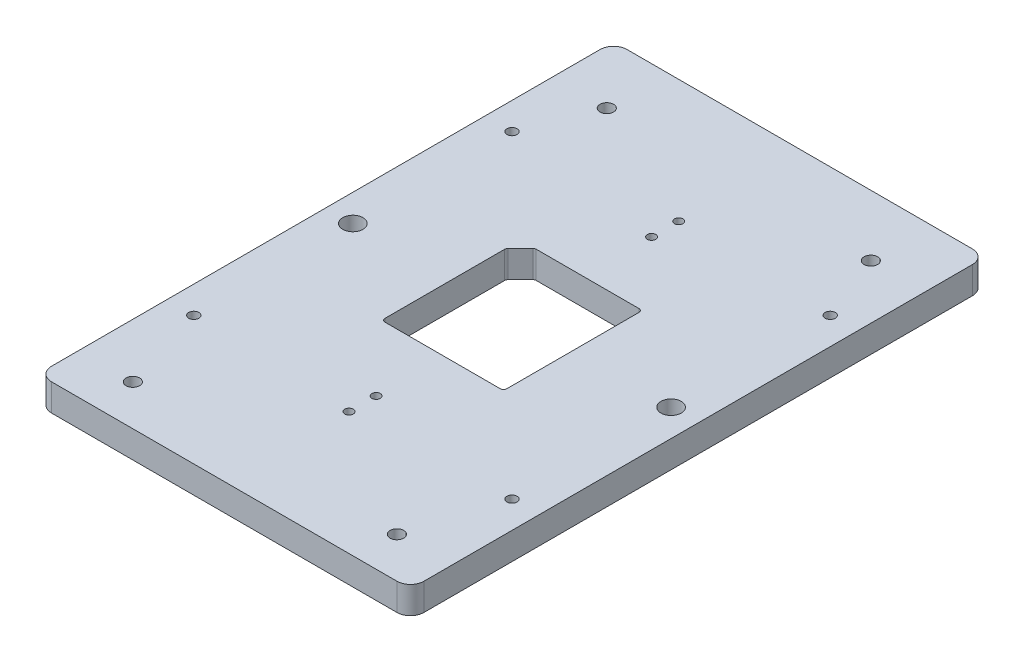
ISO-10303-21;
HEADER;
FILE_DESCRIPTION(('STEP AP214'),'2;1');
FILE_NAME('part.step','',(''),(''),'','','');
FILE_SCHEMA(('AUTOMOTIVE_DESIGN { 1 0 10303 214 1 1 1 1 }'));
ENDSEC;
DATA;
#1=APPLICATION_CONTEXT('core data for automotive mechanical design processes');
#2=APPLICATION_PROTOCOL_DEFINITION('international standard','automotive_design',2000,#1);
#3=PRODUCT_CONTEXT('',#1,'mechanical');
#4=PRODUCT('Part','Part','',(#3));
#5=PRODUCT_RELATED_PRODUCT_CATEGORY('part','',(#4));
#6=PRODUCT_DEFINITION_FORMATION('','',#4);
#7=PRODUCT_DEFINITION_CONTEXT('part definition',#1,'design');
#8=PRODUCT_DEFINITION('design','',#6,#7);
#9=PRODUCT_DEFINITION_SHAPE('','',#8);
#10=(LENGTH_UNIT() NAMED_UNIT(*) SI_UNIT(.MILLI.,.METRE.));
#11=(NAMED_UNIT(*) PLANE_ANGLE_UNIT() SI_UNIT($,.RADIAN.));
#12=(NAMED_UNIT(*) SI_UNIT($,.STERADIAN.) SOLID_ANGLE_UNIT());
#13=UNCERTAINTY_MEASURE_WITH_UNIT(LENGTH_MEASURE(1.E-05),#10,'distance_accuracy_value','');
#14=(GEOMETRIC_REPRESENTATION_CONTEXT(3) GLOBAL_UNCERTAINTY_ASSIGNED_CONTEXT((#13)) GLOBAL_UNIT_ASSIGNED_CONTEXT((#10,
#11,#12)) REPRESENTATION_CONTEXT('',''));
#15=CARTESIAN_POINT('',(0.,0.,0.));
#16=DIRECTION('',(0.,0.,1.));
#17=DIRECTION('',(1.,0.,0.));
#18=AXIS2_PLACEMENT_3D('',#15,#16,#17);
#19=CARTESIAN_POINT('',(-51.,8.,81.));
#20=DIRECTION('',(0.,-1.,0.));
#21=DIRECTION('',(0.,0.,-1.));
#22=AXIS2_PLACEMENT_3D('',#19,#20,#21);
#23=CYLINDRICAL_SURFACE('',#22,4.);
#24=CARTESIAN_POINT('',(-51.,0.,81.));
#25=DIRECTION('',(0.,1.,0.));
#26=DIRECTION('',(0.,0.,1.));
#27=AXIS2_PLACEMENT_3D('',#24,#25,#26);
#28=CIRCLE('',#27,4.);
#29=CARTESIAN_POINT('',(-55.,0.,81.));
#30=VERTEX_POINT('',#29);
#31=CARTESIAN_POINT('',(-51.,0.,85.));
#32=VERTEX_POINT('',#31);
#33=EDGE_CURVE('E138',#30,#32,#28,.T.);
#34=ORIENTED_EDGE('',*,*,#33,.T.);
#35=DIRECTION('',(0.,-1.,0.));
#36=VECTOR('',#35,1.);
#37=CARTESIAN_POINT('',(-51.,8.,85.));
#38=LINE('',#37,#36);
#39=CARTESIAN_POINT('',(-51.,8.,85.));
#40=VERTEX_POINT('',#39);
#41=EDGE_CURVE('E11',#40,#32,#38,.T.);
#42=ORIENTED_EDGE('',*,*,#41,.F.);
#43=CARTESIAN_POINT('',(-51.,8.,81.));
#44=DIRECTION('',(0.,1.,0.));
#45=DIRECTION('',(0.,0.,1.));
#46=AXIS2_PLACEMENT_3D('',#43,#44,#45);
#47=CIRCLE('',#46,4.);
#48=CARTESIAN_POINT('',(-55.,8.,81.));
#49=VERTEX_POINT('',#48);
#50=EDGE_CURVE('E152',#49,#40,#47,.T.);
#51=ORIENTED_EDGE('',*,*,#50,.F.);
#52=DIRECTION('',(0.,-1.,0.));
#53=VECTOR('',#52,1.);
#54=CARTESIAN_POINT('',(-55.,8.,81.));
#55=LINE('',#54,#53);
#56=EDGE_CURVE('E137',#49,#30,#55,.T.);
#57=ORIENTED_EDGE('',*,*,#56,.T.);
#58=EDGE_LOOP('',(#34,#42,#51,#57));
#59=FACE_BOUND('',#58,.T.);
#60=ADVANCED_FACE('F36',(#59),#23,.T.);
#61=CARTESIAN_POINT('',(-51.,8.,85.));
#62=DIRECTION('',(0.,0.,-1.));
#63=DIRECTION('',(-1.,0.,0.));
#64=AXIS2_PLACEMENT_3D('',#61,#62,#63);
#65=PLANE('',#64);
#66=DIRECTION('',(1.,0.,0.));
#67=VECTOR('',#66,1.);
#68=CARTESIAN_POINT('',(-51.,0.,85.));
#69=LINE('',#68,#67);
#70=CARTESIAN_POINT('',(51.,0.,85.));
#71=VERTEX_POINT('',#70);
#72=EDGE_CURVE('E141',#32,#71,#69,.T.);
#73=ORIENTED_EDGE('',*,*,#72,.T.);
#74=DIRECTION('',(0.,-1.,0.));
#75=VECTOR('',#74,1.);
#76=CARTESIAN_POINT('',(51.,8.,85.));
#77=LINE('',#76,#75);
#78=CARTESIAN_POINT('',(51.,8.,85.));
#79=VERTEX_POINT('',#78);
#80=EDGE_CURVE('E50',#79,#71,#77,.T.);
#81=ORIENTED_EDGE('',*,*,#80,.F.);
#82=DIRECTION('',(1.,0.,0.));
#83=VECTOR('',#82,1.);
#84=CARTESIAN_POINT('',(-51.,8.,85.));
#85=LINE('',#84,#83);
#86=EDGE_CURVE('E99',#40,#79,#85,.T.);
#87=ORIENTED_EDGE('',*,*,#86,.F.);
#88=ORIENTED_EDGE('',*,*,#41,.T.);
#89=EDGE_LOOP('',(#73,#81,#87,#88));
#90=FACE_BOUND('',#89,.T.);
#91=ADVANCED_FACE('F215',(#90),#65,.F.);
#92=CARTESIAN_POINT('',(51.,8.,81.));
#93=DIRECTION('',(0.,-1.,0.));
#94=DIRECTION('',(0.,0.,-1.));
#95=AXIS2_PLACEMENT_3D('',#92,#93,#94);
#96=CYLINDRICAL_SURFACE('',#95,4.);
#97=CARTESIAN_POINT('',(51.,0.,81.));
#98=DIRECTION('',(0.,1.,0.));
#99=DIRECTION('',(0.,0.,1.));
#100=AXIS2_PLACEMENT_3D('',#97,#98,#99);
#101=CIRCLE('',#100,4.);
#102=CARTESIAN_POINT('',(55.,0.,81.));
#103=VERTEX_POINT('',#102);
#104=EDGE_CURVE('E144',#71,#103,#101,.T.);
#105=ORIENTED_EDGE('',*,*,#104,.T.);
#106=DIRECTION('',(0.,-1.,0.));
#107=VECTOR('',#106,1.);
#108=CARTESIAN_POINT('',(55.,8.,81.));
#109=LINE('',#108,#107);
#110=CARTESIAN_POINT('',(55.,8.,81.));
#111=VERTEX_POINT('',#110);
#112=EDGE_CURVE('E161',#111,#103,#109,.T.);
#113=ORIENTED_EDGE('',*,*,#112,.F.);
#114=CARTESIAN_POINT('',(51.,8.,81.));
#115=DIRECTION('',(0.,1.,0.));
#116=DIRECTION('',(0.,0.,1.));
#117=AXIS2_PLACEMENT_3D('',#114,#115,#116);
#118=CIRCLE('',#117,4.);
#119=EDGE_CURVE('E226',#79,#111,#118,.T.);
#120=ORIENTED_EDGE('',*,*,#119,.F.);
#121=ORIENTED_EDGE('',*,*,#80,.T.);
#122=EDGE_LOOP('',(#105,#113,#120,#121));
#123=FACE_BOUND('',#122,.T.);
#124=ADVANCED_FACE('F220',(#123),#96,.T.);
#125=CARTESIAN_POINT('',(55.,8.,-80.9999999999999));
#126=DIRECTION('',(-1.,0.,0.));
#127=DIRECTION('',(0.,0.,1.));
#128=AXIS2_PLACEMENT_3D('',#125,#126,#127);
#129=PLANE('',#128);
#130=DIRECTION('',(0.,0.,-1.));
#131=VECTOR('',#130,1.);
#132=CARTESIAN_POINT('',(55.,0.,-80.9999999999999));
#133=LINE('',#132,#131);
#134=CARTESIAN_POINT('',(55.,0.,-80.9999999999999));
#135=VERTEX_POINT('',#134);
#136=EDGE_CURVE('E150',#103,#135,#133,.T.);
#137=ORIENTED_EDGE('',*,*,#136,.T.);
#138=DIRECTION('',(0.,-1.,0.));
#139=VECTOR('',#138,1.);
#140=CARTESIAN_POINT('',(55.,8.,-80.9999999999999));
#141=LINE('',#140,#139);
#142=CARTESIAN_POINT('',(55.,8.,-80.9999999999999));
#143=VERTEX_POINT('',#142);
#144=EDGE_CURVE('E158',#143,#135,#141,.T.);
#145=ORIENTED_EDGE('',*,*,#144,.F.);
#146=DIRECTION('',(0.,0.,-1.));
#147=VECTOR('',#146,1.);
#148=CARTESIAN_POINT('',(55.,8.,-80.9999999999999));
#149=LINE('',#148,#147);
#150=EDGE_CURVE('E227',#111,#143,#149,.T.);
#151=ORIENTED_EDGE('',*,*,#150,.F.);
#152=ORIENTED_EDGE('',*,*,#112,.T.);
#153=EDGE_LOOP('',(#137,#145,#151,#152));
#154=FACE_BOUND('',#153,.T.);
#155=ADVANCED_FACE('F502',(#154),#129,.F.);
#156=CARTESIAN_POINT('',(51.,8.,-81.));
#157=DIRECTION('',(0.,-1.,0.));
#158=DIRECTION('',(0.,0.,-1.));
#159=AXIS2_PLACEMENT_3D('',#156,#157,#158);
#160=CYLINDRICAL_SURFACE('',#159,4.);
#161=CARTESIAN_POINT('',(51.,0.,-81.));
#162=DIRECTION('',(0.,1.,0.));
#163=DIRECTION('',(0.,0.,-1.));
#164=AXIS2_PLACEMENT_3D('',#161,#162,#163);
#165=CIRCLE('',#164,4.);
#166=CARTESIAN_POINT('',(51.,0.,-85.));
#167=VERTEX_POINT('',#166);
#168=EDGE_CURVE('E149',#135,#167,#165,.T.);
#169=ORIENTED_EDGE('',*,*,#168,.T.);
#170=DIRECTION('',(0.,-1.,0.));
#171=VECTOR('',#170,1.);
#172=CARTESIAN_POINT('',(51.,8.,-85.));
#173=LINE('',#172,#171);
#174=CARTESIAN_POINT('',(51.,8.,-85.));
#175=VERTEX_POINT('',#174);
#176=EDGE_CURVE('E133',#175,#167,#173,.T.);
#177=ORIENTED_EDGE('',*,*,#176,.F.);
#178=CARTESIAN_POINT('',(51.,8.,-81.));
#179=DIRECTION('',(0.,1.,0.));
#180=DIRECTION('',(0.,0.,-1.));
#181=AXIS2_PLACEMENT_3D('',#178,#179,#180);
#182=CIRCLE('',#181,4.);
#183=EDGE_CURVE('E121',#143,#175,#182,.T.);
#184=ORIENTED_EDGE('',*,*,#183,.F.);
#185=ORIENTED_EDGE('',*,*,#144,.T.);
#186=EDGE_LOOP('',(#169,#177,#184,#185));
#187=FACE_BOUND('',#186,.T.);
#188=ADVANCED_FACE('F505',(#187),#160,.T.);
#189=CARTESIAN_POINT('',(-51.,8.,-85.));
#190=DIRECTION('',(0.,0.,1.));
#191=DIRECTION('',(1.,0.,0.));
#192=AXIS2_PLACEMENT_3D('',#189,#190,#191);
#193=PLANE('',#192);
#194=DIRECTION('',(-1.,0.,0.));
#195=VECTOR('',#194,1.);
#196=CARTESIAN_POINT('',(-51.,0.,-85.));
#197=LINE('',#196,#195);
#198=CARTESIAN_POINT('',(-51.,0.,-85.));
#199=VERTEX_POINT('',#198);
#200=EDGE_CURVE('E128',#167,#199,#197,.T.);
#201=ORIENTED_EDGE('',*,*,#200,.T.);
#202=DIRECTION('',(0.,-1.,0.));
#203=VECTOR('',#202,1.);
#204=CARTESIAN_POINT('',(-51.,8.,-85.));
#205=LINE('',#204,#203);
#206=CARTESIAN_POINT('',(-51.,8.,-85.));
#207=VERTEX_POINT('',#206);
#208=EDGE_CURVE('E130',#207,#199,#205,.T.);
#209=ORIENTED_EDGE('',*,*,#208,.F.);
#210=DIRECTION('',(-1.,0.,0.));
#211=VECTOR('',#210,1.);
#212=CARTESIAN_POINT('',(-51.,8.,-85.));
#213=LINE('',#212,#211);
#214=EDGE_CURVE('E113',#175,#207,#213,.T.);
#215=ORIENTED_EDGE('',*,*,#214,.F.);
#216=ORIENTED_EDGE('',*,*,#176,.T.);
#217=EDGE_LOOP('',(#201,#209,#215,#216));
#218=FACE_BOUND('',#217,.T.);
#219=ADVANCED_FACE('F126',(#218),#193,.F.);
#220=CARTESIAN_POINT('',(-51.,8.,-81.));
#221=DIRECTION('',(0.,-1.,0.));
#222=DIRECTION('',(0.,0.,-1.));
#223=AXIS2_PLACEMENT_3D('',#220,#221,#222);
#224=CYLINDRICAL_SURFACE('',#223,4.);
#225=CARTESIAN_POINT('',(-51.,0.,-81.));
#226=DIRECTION('',(0.,1.,0.));
#227=DIRECTION('',(0.,0.,1.));
#228=AXIS2_PLACEMENT_3D('',#225,#226,#227);
#229=CIRCLE('',#228,4.);
#230=CARTESIAN_POINT('',(-55.,0.,-80.9999999999999));
#231=VERTEX_POINT('',#230);
#232=EDGE_CURVE('E88',#199,#231,#229,.T.);
#233=ORIENTED_EDGE('',*,*,#232,.T.);
#234=DIRECTION('',(0.,-1.,0.));
#235=VECTOR('',#234,1.);
#236=CARTESIAN_POINT('',(-55.,8.,-80.9999999999999));
#237=LINE('',#236,#235);
#238=CARTESIAN_POINT('',(-55.,8.,-80.9999999999999));
#239=VERTEX_POINT('',#238);
#240=EDGE_CURVE('E135',#239,#231,#237,.T.);
#241=ORIENTED_EDGE('',*,*,#240,.F.);
#242=CARTESIAN_POINT('',(-51.,8.,-81.));
#243=DIRECTION('',(0.,1.,0.));
#244=DIRECTION('',(0.,0.,1.));
#245=AXIS2_PLACEMENT_3D('',#242,#243,#244);
#246=CIRCLE('',#245,4.);
#247=EDGE_CURVE('E117',#207,#239,#246,.T.);
#248=ORIENTED_EDGE('',*,*,#247,.F.);
#249=ORIENTED_EDGE('',*,*,#208,.T.);
#250=EDGE_LOOP('',(#233,#241,#248,#249));
#251=FACE_BOUND('',#250,.T.);
#252=ADVANCED_FACE('F134',(#251),#224,.T.);
#253=CARTESIAN_POINT('',(-55.,8.,-80.9999999999999));
#254=DIRECTION('',(1.,0.,0.));
#255=DIRECTION('',(0.,0.,-1.));
#256=AXIS2_PLACEMENT_3D('',#253,#254,#255);
#257=PLANE('',#256);
#258=DIRECTION('',(0.,0.,1.));
#259=VECTOR('',#258,1.);
#260=CARTESIAN_POINT('',(-55.,0.,-80.9999999999999));
#261=LINE('',#260,#259);
#262=EDGE_CURVE('E95',#231,#30,#261,.T.);
#263=ORIENTED_EDGE('',*,*,#262,.T.);
#264=ORIENTED_EDGE('',*,*,#56,.F.);
#265=DIRECTION('',(0.,0.,1.));
#266=VECTOR('',#265,1.);
#267=CARTESIAN_POINT('',(-55.,8.,-80.9999999999999));
#268=LINE('',#267,#266);
#269=EDGE_CURVE('E57',#239,#49,#268,.T.);
#270=ORIENTED_EDGE('',*,*,#269,.F.);
#271=ORIENTED_EDGE('',*,*,#240,.T.);
#272=EDGE_LOOP('',(#263,#264,#270,#271));
#273=FACE_BOUND('',#272,.T.);
#274=ADVANCED_FACE('F492',(#273),#257,.F.);
#275=CARTESIAN_POINT('',(-51.,8.,81.));
#276=DIRECTION('',(0.,1.,0.));
#277=DIRECTION('',(0.,0.,1.));
#278=AXIS2_PLACEMENT_3D('',#275,#276,#277);
#279=PLANE('',#278);
#280=CARTESIAN_POINT('',(0.547678372327283,8.,48.6869615594258));
#281=DIRECTION('',(0.,1.,0.));
#282=DIRECTION('',(0.,0.,1.));
#283=AXIS2_PLACEMENT_3D('',#280,#281,#282);
#284=CIRCLE('',#283,1.25);
#285=CARTESIAN_POINT('',(0.547678372327283,8.,49.9369615594258));
#286=VERTEX_POINT('',#285);
#287=EDGE_CURVE('E367',#286,#286,#284,.F.);
#288=ORIENTED_EDGE('',*,*,#287,.T.);
#289=EDGE_LOOP('',(#288));
#290=FACE_BOUND('',#289,.T.);
#291=CARTESIAN_POINT('',(0.547678372326984,8.,-48.6869615594257));
#292=DIRECTION('',(0.,1.,0.));
#293=DIRECTION('',(0.,0.,1.));
#294=AXIS2_PLACEMENT_3D('',#291,#292,#293);
#295=CIRCLE('',#294,1.25);
#296=CARTESIAN_POINT('',(0.547678372326984,8.,-47.4369615594257));
#297=VERTEX_POINT('',#296);
#298=EDGE_CURVE('E371',#297,#297,#295,.F.);
#299=ORIENTED_EDGE('',*,*,#298,.T.);
#300=EDGE_LOOP('',(#299));
#301=FACE_BOUND('',#300,.T.);
#302=CARTESIAN_POINT('',(0.54767837232704,8.,-40.6869615594257));
#303=DIRECTION('',(0.,1.,0.));
#304=DIRECTION('',(0.,0.,1.));
#305=AXIS2_PLACEMENT_3D('',#302,#303,#304);
#306=CIRCLE('',#305,1.25000000000001);
#307=CARTESIAN_POINT('',(0.54767837232704,8.,-39.4369615594256));
#308=VERTEX_POINT('',#307);
#309=EDGE_CURVE('E381',#308,#308,#306,.F.);
#310=ORIENTED_EDGE('',*,*,#309,.T.);
#311=EDGE_LOOP('',(#310));
#312=FACE_BOUND('',#311,.T.);
#313=CARTESIAN_POINT('',(0.54767837232729,8.,40.6869615594258));
#314=DIRECTION('',(0.,1.,0.));
#315=DIRECTION('',(0.,0.,1.));
#316=AXIS2_PLACEMENT_3D('',#313,#314,#315);
#317=CIRCLE('',#316,1.25);
#318=CARTESIAN_POINT('',(0.54767837232729,8.,41.9369615594258));
#319=VERTEX_POINT('',#318);
#320=EDGE_CURVE('E351',#319,#319,#317,.F.);
#321=ORIENTED_EDGE('',*,*,#320,.T.);
#322=EDGE_LOOP('',(#321));
#323=FACE_BOUND('',#322,.T.);
#324=CARTESIAN_POINT('',(39.,8.,-67.));
#325=DIRECTION('',(0.,1.,0.));
#326=DIRECTION('',(0.,0.,1.));
#327=AXIS2_PLACEMENT_3D('',#324,#325,#326);
#328=CIRCLE('',#327,2.);
#329=CARTESIAN_POINT('',(39.,8.,-65.));
#330=VERTEX_POINT('',#329);
#331=EDGE_CURVE('E357',#330,#330,#328,.T.);
#332=ORIENTED_EDGE('',*,*,#331,.F.);
#333=EDGE_LOOP('',(#332));
#334=FACE_BOUND('',#333,.T.);
#335=CARTESIAN_POINT('',(-39.,8.,-67.));
#336=DIRECTION('',(0.,1.,0.));
#337=DIRECTION('',(0.,0.,1.));
#338=AXIS2_PLACEMENT_3D('',#335,#336,#337);
#339=CIRCLE('',#338,2.);
#340=CARTESIAN_POINT('',(-39.,8.,-65.));
#341=VERTEX_POINT('',#340);
#342=EDGE_CURVE('E355',#341,#341,#339,.T.);
#343=ORIENTED_EDGE('',*,*,#342,.F.);
#344=EDGE_LOOP('',(#343));
#345=FACE_BOUND('',#344,.T.);
#346=CARTESIAN_POINT('',(47.,8.,47.));
#347=DIRECTION('',(0.,1.,0.));
#348=DIRECTION('',(0.,0.,1.));
#349=AXIS2_PLACEMENT_3D('',#346,#347,#348);
#350=CIRCLE('',#349,1.5);
#351=CARTESIAN_POINT('',(47.,8.,48.5));
#352=VERTEX_POINT('',#351);
#353=EDGE_CURVE('E244',#352,#352,#350,.T.);
#354=ORIENTED_EDGE('',*,*,#353,.F.);
#355=EDGE_LOOP('',(#354));
#356=FACE_BOUND('',#355,.T.);
#357=CARTESIAN_POINT('',(-47.,8.,47.));
#358=DIRECTION('',(0.,1.,0.));
#359=DIRECTION('',(0.,0.,-1.));
#360=AXIS2_PLACEMENT_3D('',#357,#358,#359);
#361=CIRCLE('',#360,1.5);
#362=CARTESIAN_POINT('',(-47.,8.,45.5));
#363=VERTEX_POINT('',#362);
#364=EDGE_CURVE('E242',#363,#363,#361,.T.);
#365=ORIENTED_EDGE('',*,*,#364,.F.);
#366=EDGE_LOOP('',(#365));
#367=FACE_BOUND('',#366,.T.);
#368=CARTESIAN_POINT('',(-39.,8.,73.));
#369=DIRECTION('',(0.,1.,0.));
#370=DIRECTION('',(0.,0.,-1.));
#371=AXIS2_PLACEMENT_3D('',#368,#369,#370);
#372=CIRCLE('',#371,2.);
#373=CARTESIAN_POINT('',(-39.,8.,71.));
#374=VERTEX_POINT('',#373);
#375=EDGE_CURVE('E249',#374,#374,#372,.T.);
#376=ORIENTED_EDGE('',*,*,#375,.F.);
#377=EDGE_LOOP('',(#376));
#378=FACE_BOUND('',#377,.T.);
#379=CARTESIAN_POINT('',(-47.,8.,0.));
#380=DIRECTION('',(0.,1.,0.));
#381=DIRECTION('',(0.,0.,1.));
#382=AXIS2_PLACEMENT_3D('',#379,#380,#381);
#383=CIRCLE('',#382,3.);
#384=CARTESIAN_POINT('',(-47.,8.,3.));
#385=VERTEX_POINT('',#384);
#386=EDGE_CURVE('E248',#385,#385,#383,.T.);
#387=ORIENTED_EDGE('',*,*,#386,.F.);
#388=EDGE_LOOP('',(#387));
#389=FACE_BOUND('',#388,.T.);
#390=CARTESIAN_POINT('',(-47.,8.,-47.));
#391=DIRECTION('',(0.,1.,0.));
#392=DIRECTION('',(0.,0.,1.));
#393=AXIS2_PLACEMENT_3D('',#390,#391,#392);
#394=CIRCLE('',#393,1.5);
#395=CARTESIAN_POINT('',(-47.,8.,-45.5));
#396=VERTEX_POINT('',#395);
#397=EDGE_CURVE('E168',#396,#396,#394,.T.);
#398=ORIENTED_EDGE('',*,*,#397,.F.);
#399=EDGE_LOOP('',(#398));
#400=FACE_BOUND('',#399,.T.);
#401=CARTESIAN_POINT('',(47.,8.,-47.));
#402=DIRECTION('',(0.,1.,0.));
#403=DIRECTION('',(0.,0.,-1.));
#404=AXIS2_PLACEMENT_3D('',#401,#402,#403);
#405=CIRCLE('',#404,1.5);
#406=CARTESIAN_POINT('',(47.,8.,-48.5));
#407=VERTEX_POINT('',#406);
#408=EDGE_CURVE('E237',#407,#407,#405,.T.);
#409=ORIENTED_EDGE('',*,*,#408,.F.);
#410=EDGE_LOOP('',(#409));
#411=FACE_BOUND('',#410,.T.);
#412=CARTESIAN_POINT('',(39.,8.,73.));
#413=DIRECTION('',(0.,1.,0.));
#414=DIRECTION('',(0.,0.,1.));
#415=AXIS2_PLACEMENT_3D('',#412,#413,#414);
#416=CIRCLE('',#415,2.);
#417=CARTESIAN_POINT('',(39.,8.,75.));
#418=VERTEX_POINT('',#417);
#419=EDGE_CURVE('E239',#418,#418,#416,.T.);
#420=ORIENTED_EDGE('',*,*,#419,.F.);
#421=EDGE_LOOP('',(#420));
#422=FACE_BOUND('',#421,.T.);
#423=CARTESIAN_POINT('',(47.,8.,0.));
#424=DIRECTION('',(0.,1.,0.));
#425=DIRECTION('',(0.,0.,1.));
#426=AXIS2_PLACEMENT_3D('',#423,#424,#425);
#427=CIRCLE('',#426,3.);
#428=CARTESIAN_POINT('',(47.,8.,3.));
#429=VERTEX_POINT('',#428);
#430=EDGE_CURVE('E251',#429,#429,#427,.T.);
#431=ORIENTED_EDGE('',*,*,#430,.F.);
#432=EDGE_LOOP('',(#431));
#433=FACE_BOUND('',#432,.T.);
#434=ORIENTED_EDGE('',*,*,#50,.T.);
#435=ORIENTED_EDGE('',*,*,#86,.T.);
#436=ORIENTED_EDGE('',*,*,#119,.T.);
#437=ORIENTED_EDGE('',*,*,#150,.T.);
#438=ORIENTED_EDGE('',*,*,#183,.T.);
#439=ORIENTED_EDGE('',*,*,#214,.T.);
#440=ORIENTED_EDGE('',*,*,#247,.T.);
#441=ORIENTED_EDGE('',*,*,#269,.T.);
#442=EDGE_LOOP('',(#434,#435,#436,#437,#438,#439,#440,#441));
#443=FACE_BOUND('',#442,.T.);
#444=DIRECTION('',(1.,0.,0.));
#445=VECTOR('',#444,1.);
#446=CARTESIAN_POINT('',(-13.3431457505076,8.00000000000001,-20.5));
#447=LINE('',#446,#445);
#448=CARTESIAN_POINT('',(-13.3431457505076,8.00000000000001,-20.5));
#449=VERTEX_POINT('',#448);
#450=CARTESIAN_POINT('',(17.,8.00000000000001,-20.5));
#451=VERTEX_POINT('',#450);
#452=EDGE_CURVE('E322',#449,#451,#447,.T.);
#453=ORIENTED_EDGE('',*,*,#452,.T.);
#454=CARTESIAN_POINT('',(17.,8.00000000000001,-19.5));
#455=DIRECTION('',(0.,1.,0.));
#456=DIRECTION('',(0.,0.,1.));
#457=AXIS2_PLACEMENT_3D('',#454,#455,#456);
#458=CIRCLE('',#457,1.);
#459=CARTESIAN_POINT('',(18.,8.00000000000001,-19.5));
#460=VERTEX_POINT('',#459);
#461=EDGE_CURVE('E301',#451,#460,#458,.F.);
#462=ORIENTED_EDGE('',*,*,#461,.T.);
#463=DIRECTION('',(0.,0.,1.));
#464=VECTOR('',#463,1.);
#465=CARTESIAN_POINT('',(18.,8.00000000000001,-19.5));
#466=LINE('',#465,#464);
#467=CARTESIAN_POINT('',(18.,8.00000000000001,19.5));
#468=VERTEX_POINT('',#467);
#469=EDGE_CURVE('E297',#460,#468,#466,.T.);
#470=ORIENTED_EDGE('',*,*,#469,.T.);
#471=CARTESIAN_POINT('',(17.,8.00000000000001,19.5));
#472=DIRECTION('',(0.,1.,0.));
#473=DIRECTION('',(0.,0.,1.));
#474=AXIS2_PLACEMENT_3D('',#471,#472,#473);
#475=CIRCLE('',#474,1.);
#476=CARTESIAN_POINT('',(17.,8.00000000000001,20.5));
#477=VERTEX_POINT('',#476);
#478=EDGE_CURVE('E304',#468,#477,#475,.F.);
#479=ORIENTED_EDGE('',*,*,#478,.T.);
#480=DIRECTION('',(-1.,0.,0.));
#481=VECTOR('',#480,1.);
#482=CARTESIAN_POINT('',(17.,8.00000000000001,20.5));
#483=LINE('',#482,#481);
#484=CARTESIAN_POINT('',(-17.,8.00000000000001,20.5));
#485=VERTEX_POINT('',#484);
#486=EDGE_CURVE('E307',#477,#485,#483,.T.);
#487=ORIENTED_EDGE('',*,*,#486,.T.);
#488=CARTESIAN_POINT('',(-17.,8.00000000000001,19.5));
#489=DIRECTION('',(0.,1.,0.));
#490=DIRECTION('',(0.,0.,1.));
#491=AXIS2_PLACEMENT_3D('',#488,#489,#490);
#492=CIRCLE('',#491,1.);
#493=CARTESIAN_POINT('',(-18.,8.00000000000001,19.5));
#494=VERTEX_POINT('',#493);
#495=EDGE_CURVE('E309',#485,#494,#492,.F.);
#496=ORIENTED_EDGE('',*,*,#495,.T.);
#497=DIRECTION('',(0.,0.,-1.));
#498=VECTOR('',#497,1.);
#499=CARTESIAN_POINT('',(-18.,8.00000000000001,19.5));
#500=LINE('',#499,#498);
#501=CARTESIAN_POINT('',(-18.,8.00000000000001,-15.8431457505076));
#502=VERTEX_POINT('',#501);
#503=EDGE_CURVE('E311',#494,#502,#500,.T.);
#504=ORIENTED_EDGE('',*,*,#503,.T.);
#505=CARTESIAN_POINT('',(-17.,8.00000000000001,-15.8431457505076));
#506=DIRECTION('',(0.,1.,0.));
#507=DIRECTION('',(0.,0.,1.));
#508=AXIS2_PLACEMENT_3D('',#505,#506,#507);
#509=CIRCLE('',#508,1.);
#510=CARTESIAN_POINT('',(-17.7071067811865,8.00000000000001,-16.5502525316941));
#511=VERTEX_POINT('',#510);
#512=EDGE_CURVE('E316',#502,#511,#509,.F.);
#513=ORIENTED_EDGE('',*,*,#512,.T.);
#514=DIRECTION('',(0.707106781186546,0.,-0.70710678118655));
#515=VECTOR('',#514,1.);
#516=CARTESIAN_POINT('',(-17.7071067811865,8.00000000000001,-16.5502525316941));
#517=LINE('',#516,#515);
#518=CARTESIAN_POINT('',(-14.0502525316942,8.00000000000001,-20.2071067811865));
#519=VERTEX_POINT('',#518);
#520=EDGE_CURVE('E317',#511,#519,#517,.T.);
#521=ORIENTED_EDGE('',*,*,#520,.T.);
#522=CARTESIAN_POINT('',(-13.3431457505076,8.00000000000001,-19.5));
#523=DIRECTION('',(0.,1.,0.));
#524=DIRECTION('',(0.,0.,1.));
#525=AXIS2_PLACEMENT_3D('',#522,#523,#524);
#526=CIRCLE('',#525,1.);
#527=EDGE_CURVE('E256',#519,#449,#526,.F.);
#528=ORIENTED_EDGE('',*,*,#527,.T.);
#529=EDGE_LOOP('',(#453,#462,#470,#479,#487,#496,#504,#513,#521,#528));
#530=FACE_BOUND('',#529,.T.);
#531=ADVANCED_FACE('F120',(#290,#301,#312,#323,#334,#345,#356,#367,#378,#389,#400,#411,#422,
#433,#443,#530),#279,.T.);
#532=CARTESIAN_POINT('',(-51.,0.,81.));
#533=DIRECTION('',(0.,1.,0.));
#534=DIRECTION('',(0.,0.,1.));
#535=AXIS2_PLACEMENT_3D('',#532,#533,#534);
#536=PLANE('',#535);
#537=CARTESIAN_POINT('',(0.547678372327283,0.,48.6869615594258));
#538=DIRECTION('',(0.,-1.,0.));
#539=DIRECTION('',(0.,0.,-1.));
#540=AXIS2_PLACEMENT_3D('',#537,#538,#539);
#541=CIRCLE('',#540,1.25);
#542=CARTESIAN_POINT('',(0.547678372327283,0.,47.4369615594258));
#543=VERTEX_POINT('',#542);
#544=EDGE_CURVE('E368',#543,#543,#541,.T.);
#545=ORIENTED_EDGE('',*,*,#544,.F.);
#546=EDGE_LOOP('',(#545));
#547=FACE_BOUND('',#546,.T.);
#548=CARTESIAN_POINT('',(0.547678372326984,0.,-48.6869615594257));
#549=DIRECTION('',(0.,-1.,0.));
#550=DIRECTION('',(0.,0.,1.));
#551=AXIS2_PLACEMENT_3D('',#548,#549,#550);
#552=CIRCLE('',#551,1.25);
#553=CARTESIAN_POINT('',(0.547678372326984,0.,-47.4369615594257));
#554=VERTEX_POINT('',#553);
#555=EDGE_CURVE('E370',#554,#554,#552,.T.);
#556=ORIENTED_EDGE('',*,*,#555,.F.);
#557=EDGE_LOOP('',(#556));
#558=FACE_BOUND('',#557,.T.);
#559=CARTESIAN_POINT('',(0.54767837232704,0.,-40.6869615594257));
#560=DIRECTION('',(0.,-1.,0.));
#561=DIRECTION('',(0.,0.,1.));
#562=AXIS2_PLACEMENT_3D('',#559,#560,#561);
#563=CIRCLE('',#562,1.25000000000001);
#564=CARTESIAN_POINT('',(0.54767837232704,0.,-39.4369615594256));
#565=VERTEX_POINT('',#564);
#566=EDGE_CURVE('E372',#565,#565,#563,.T.);
#567=ORIENTED_EDGE('',*,*,#566,.F.);
#568=EDGE_LOOP('',(#567));
#569=FACE_BOUND('',#568,.T.);
#570=CARTESIAN_POINT('',(0.54767837232729,0.,40.6869615594258));
#571=DIRECTION('',(0.,-1.,0.));
#572=DIRECTION('',(0.,0.,-1.));
#573=AXIS2_PLACEMENT_3D('',#570,#571,#572);
#574=CIRCLE('',#573,1.25);
#575=CARTESIAN_POINT('',(0.54767837232729,0.,39.4369615594258));
#576=VERTEX_POINT('',#575);
#577=EDGE_CURVE('E361',#576,#576,#574,.T.);
#578=ORIENTED_EDGE('',*,*,#577,.F.);
#579=EDGE_LOOP('',(#578));
#580=FACE_BOUND('',#579,.T.);
#581=CARTESIAN_POINT('',(39.,0.,-67.));
#582=DIRECTION('',(0.,1.,0.));
#583=DIRECTION('',(0.,0.,1.));
#584=AXIS2_PLACEMENT_3D('',#581,#582,#583);
#585=CIRCLE('',#584,2.);
#586=CARTESIAN_POINT('',(39.,0.,-65.));
#587=VERTEX_POINT('',#586);
#588=EDGE_CURVE('E299',#587,#587,#585,.T.);
#589=ORIENTED_EDGE('',*,*,#588,.T.);
#590=EDGE_LOOP('',(#589));
#591=FACE_BOUND('',#590,.T.);
#592=CARTESIAN_POINT('',(-39.,0.,-67.));
#593=DIRECTION('',(0.,1.,0.));
#594=DIRECTION('',(0.,0.,1.));
#595=AXIS2_PLACEMENT_3D('',#592,#593,#594);
#596=CIRCLE('',#595,2.);
#597=CARTESIAN_POINT('',(-39.,0.,-65.));
#598=VERTEX_POINT('',#597);
#599=EDGE_CURVE('E349',#598,#598,#596,.T.);
#600=ORIENTED_EDGE('',*,*,#599,.T.);
#601=EDGE_LOOP('',(#600));
#602=FACE_BOUND('',#601,.T.);
#603=CARTESIAN_POINT('',(47.,0.,47.));
#604=DIRECTION('',(0.,1.,0.));
#605=DIRECTION('',(0.,0.,1.));
#606=AXIS2_PLACEMENT_3D('',#603,#604,#605);
#607=CIRCLE('',#606,1.5);
#608=CARTESIAN_POINT('',(47.,0.,48.5));
#609=VERTEX_POINT('',#608);
#610=EDGE_CURVE('E41',#609,#609,#607,.T.);
#611=ORIENTED_EDGE('',*,*,#610,.T.);
#612=EDGE_LOOP('',(#611));
#613=FACE_BOUND('',#612,.T.);
#614=CARTESIAN_POINT('',(-47.,0.,47.));
#615=DIRECTION('',(0.,1.,0.));
#616=DIRECTION('',(0.,0.,1.));
#617=AXIS2_PLACEMENT_3D('',#614,#615,#616);
#618=CIRCLE('',#617,1.5);
#619=CARTESIAN_POINT('',(-47.,0.,48.5));
#620=VERTEX_POINT('',#619);
#621=EDGE_CURVE('E184',#620,#620,#618,.T.);
#622=ORIENTED_EDGE('',*,*,#621,.T.);
#623=EDGE_LOOP('',(#622));
#624=FACE_BOUND('',#623,.T.);
#625=CARTESIAN_POINT('',(-39.,0.,73.));
#626=DIRECTION('',(0.,1.,0.));
#627=DIRECTION('',(0.,0.,1.));
#628=AXIS2_PLACEMENT_3D('',#625,#626,#627);
#629=CIRCLE('',#628,2.);
#630=CARTESIAN_POINT('',(-39.,0.,75.));
#631=VERTEX_POINT('',#630);
#632=EDGE_CURVE('E185',#631,#631,#629,.T.);
#633=ORIENTED_EDGE('',*,*,#632,.T.);
#634=EDGE_LOOP('',(#633));
#635=FACE_BOUND('',#634,.T.);
#636=CARTESIAN_POINT('',(-47.,0.,0.));
#637=DIRECTION('',(0.,1.,0.));
#638=DIRECTION('',(0.,0.,1.));
#639=AXIS2_PLACEMENT_3D('',#636,#637,#638);
#640=CIRCLE('',#639,3.);
#641=CARTESIAN_POINT('',(-47.,0.,3.));
#642=VERTEX_POINT('',#641);
#643=EDGE_CURVE('E178',#642,#642,#640,.T.);
#644=ORIENTED_EDGE('',*,*,#643,.T.);
#645=EDGE_LOOP('',(#644));
#646=FACE_BOUND('',#645,.T.);
#647=CARTESIAN_POINT('',(-47.,0.,-47.));
#648=DIRECTION('',(0.,1.,0.));
#649=DIRECTION('',(0.,0.,1.));
#650=AXIS2_PLACEMENT_3D('',#647,#648,#649);
#651=CIRCLE('',#650,1.5);
#652=CARTESIAN_POINT('',(-47.,0.,-45.5));
#653=VERTEX_POINT('',#652);
#654=EDGE_CURVE('E179',#653,#653,#651,.T.);
#655=ORIENTED_EDGE('',*,*,#654,.T.);
#656=EDGE_LOOP('',(#655));
#657=FACE_BOUND('',#656,.T.);
#658=CARTESIAN_POINT('',(47.,0.,-47.));
#659=DIRECTION('',(0.,1.,0.));
#660=DIRECTION('',(0.,0.,1.));
#661=AXIS2_PLACEMENT_3D('',#658,#659,#660);
#662=CIRCLE('',#661,1.5);
#663=CARTESIAN_POINT('',(47.,0.,-45.5));
#664=VERTEX_POINT('',#663);
#665=EDGE_CURVE('E171',#664,#664,#662,.T.);
#666=ORIENTED_EDGE('',*,*,#665,.T.);
#667=EDGE_LOOP('',(#666));
#668=FACE_BOUND('',#667,.T.);
#669=CARTESIAN_POINT('',(39.,0.,73.));
#670=DIRECTION('',(0.,1.,0.));
#671=DIRECTION('',(0.,0.,1.));
#672=AXIS2_PLACEMENT_3D('',#669,#670,#671);
#673=CIRCLE('',#672,2.);
#674=CARTESIAN_POINT('',(39.,0.,75.));
#675=VERTEX_POINT('',#674);
#676=EDGE_CURVE('E166',#675,#675,#673,.T.);
#677=ORIENTED_EDGE('',*,*,#676,.T.);
#678=EDGE_LOOP('',(#677));
#679=FACE_BOUND('',#678,.T.);
#680=CARTESIAN_POINT('',(47.,0.,0.));
#681=DIRECTION('',(0.,1.,0.));
#682=DIRECTION('',(0.,0.,1.));
#683=AXIS2_PLACEMENT_3D('',#680,#681,#682);
#684=CIRCLE('',#683,3.);
#685=CARTESIAN_POINT('',(47.,0.,3.));
#686=VERTEX_POINT('',#685);
#687=EDGE_CURVE('E167',#686,#686,#684,.T.);
#688=ORIENTED_EDGE('',*,*,#687,.T.);
#689=EDGE_LOOP('',(#688));
#690=FACE_BOUND('',#689,.T.);
#691=ORIENTED_EDGE('',*,*,#33,.F.);
#692=ORIENTED_EDGE('',*,*,#262,.F.);
#693=ORIENTED_EDGE('',*,*,#232,.F.);
#694=ORIENTED_EDGE('',*,*,#200,.F.);
#695=ORIENTED_EDGE('',*,*,#168,.F.);
#696=ORIENTED_EDGE('',*,*,#136,.F.);
#697=ORIENTED_EDGE('',*,*,#104,.F.);
#698=ORIENTED_EDGE('',*,*,#72,.F.);
#699=EDGE_LOOP('',(#691,#692,#693,#694,#695,#696,#697,#698));
#700=FACE_BOUND('',#699,.T.);
#701=CARTESIAN_POINT('',(17.,0.,-19.5));
#702=DIRECTION('',(0.,-1.,0.));
#703=DIRECTION('',(0.,0.,-1.));
#704=AXIS2_PLACEMENT_3D('',#701,#702,#703);
#705=CIRCLE('',#704,1.);
#706=CARTESIAN_POINT('',(17.,0.,-20.5));
#707=VERTEX_POINT('',#706);
#708=CARTESIAN_POINT('',(18.,0.,-19.5));
#709=VERTEX_POINT('',#708);
#710=EDGE_CURVE('E293',#707,#709,#705,.T.);
#711=ORIENTED_EDGE('',*,*,#710,.F.);
#712=DIRECTION('',(1.,0.,0.));
#713=VECTOR('',#712,1.);
#714=CARTESIAN_POINT('',(-13.3431457505076,0.,-20.5));
#715=LINE('',#714,#713);
#716=CARTESIAN_POINT('',(-13.3431457505076,0.,-20.5));
#717=VERTEX_POINT('',#716);
#718=EDGE_CURVE('E292',#717,#707,#715,.T.);
#719=ORIENTED_EDGE('',*,*,#718,.F.);
#720=CARTESIAN_POINT('',(-13.3431457505076,0.,-19.5));
#721=DIRECTION('',(0.,-1.,0.));
#722=DIRECTION('',(0.,0.,-1.));
#723=AXIS2_PLACEMENT_3D('',#720,#721,#722);
#724=CIRCLE('',#723,1.);
#725=CARTESIAN_POINT('',(-14.0502525316942,0.,-20.2071067811865));
#726=VERTEX_POINT('',#725);
#727=EDGE_CURVE('E286',#726,#717,#724,.T.);
#728=ORIENTED_EDGE('',*,*,#727,.F.);
#729=DIRECTION('',(0.707106781186545,0.,-0.707106781186549));
#730=VECTOR('',#729,1.);
#731=CARTESIAN_POINT('',(-17.7071067811865,0.,-16.5502525316941));
#732=LINE('',#731,#730);
#733=CARTESIAN_POINT('',(-17.7071067811865,0.,-16.5502525316941));
#734=VERTEX_POINT('',#733);
#735=EDGE_CURVE('E281',#734,#726,#732,.T.);
#736=ORIENTED_EDGE('',*,*,#735,.F.);
#737=CARTESIAN_POINT('',(-17.,0.,-15.8431457505076));
#738=DIRECTION('',(0.,-1.,0.));
#739=DIRECTION('',(0.,0.,-1.));
#740=AXIS2_PLACEMENT_3D('',#737,#738,#739);
#741=CIRCLE('',#740,1.);
#742=CARTESIAN_POINT('',(-18.,0.,-15.8431457505076));
#743=VERTEX_POINT('',#742);
#744=EDGE_CURVE('E276',#743,#734,#741,.T.);
#745=ORIENTED_EDGE('',*,*,#744,.F.);
#746=DIRECTION('',(0.,0.,-1.));
#747=VECTOR('',#746,1.);
#748=CARTESIAN_POINT('',(-18.,0.,19.5));
#749=LINE('',#748,#747);
#750=CARTESIAN_POINT('',(-18.,0.,19.5));
#751=VERTEX_POINT('',#750);
#752=EDGE_CURVE('E274',#751,#743,#749,.T.);
#753=ORIENTED_EDGE('',*,*,#752,.F.);
#754=CARTESIAN_POINT('',(-17.,0.,19.5));
#755=DIRECTION('',(0.,-1.,0.));
#756=DIRECTION('',(0.,0.,-1.));
#757=AXIS2_PLACEMENT_3D('',#754,#755,#756);
#758=CIRCLE('',#757,1.);
#759=CARTESIAN_POINT('',(-17.,0.,20.5));
#760=VERTEX_POINT('',#759);
#761=EDGE_CURVE('E271',#760,#751,#758,.T.);
#762=ORIENTED_EDGE('',*,*,#761,.F.);
#763=DIRECTION('',(-1.,0.,0.));
#764=VECTOR('',#763,1.);
#765=CARTESIAN_POINT('',(17.,0.,20.5));
#766=LINE('',#765,#764);
#767=CARTESIAN_POINT('',(17.,0.,20.5));
#768=VERTEX_POINT('',#767);
#769=EDGE_CURVE('E270',#768,#760,#766,.T.);
#770=ORIENTED_EDGE('',*,*,#769,.F.);
#771=CARTESIAN_POINT('',(17.,0.,19.5));
#772=DIRECTION('',(0.,-1.,0.));
#773=DIRECTION('',(0.,0.,-1.));
#774=AXIS2_PLACEMENT_3D('',#771,#772,#773);
#775=CIRCLE('',#774,1.);
#776=CARTESIAN_POINT('',(18.,0.,19.5));
#777=VERTEX_POINT('',#776);
#778=EDGE_CURVE('E263',#777,#768,#775,.T.);
#779=ORIENTED_EDGE('',*,*,#778,.F.);
#780=DIRECTION('',(0.,0.,1.));
#781=VECTOR('',#780,1.);
#782=CARTESIAN_POINT('',(18.,0.,-19.5));
#783=LINE('',#782,#781);
#784=EDGE_CURVE('E265',#709,#777,#783,.T.);
#785=ORIENTED_EDGE('',*,*,#784,.F.);
#786=EDGE_LOOP('',(#711,#719,#728,#736,#745,#753,#762,#770,#779,#785));
#787=FACE_BOUND('',#786,.T.);
#788=ADVANCED_FACE('F192',(#547,#558,#569,#580,#591,#602,#613,#624,#635,#646,#657,#668,#679,
#690,#700,#787),#536,.F.);
#789=CARTESIAN_POINT('',(47.,-10.,0.));
#790=DIRECTION('',(0.,1.,0.));
#791=DIRECTION('',(0.,0.,1.));
#792=AXIS2_PLACEMENT_3D('',#789,#790,#791);
#793=CYLINDRICAL_SURFACE('',#792,3.);
#794=ORIENTED_EDGE('',*,*,#430,.T.);
#795=EDGE_LOOP('',(#794));
#796=FACE_BOUND('',#795,.T.);
#797=ORIENTED_EDGE('',*,*,#687,.F.);
#798=EDGE_LOOP('',(#797));
#799=FACE_BOUND('',#798,.T.);
#800=ADVANCED_FACE('F449',(#796,#799),#793,.F.);
#801=CARTESIAN_POINT('',(39.,-10.,73.));
#802=DIRECTION('',(0.,1.,0.));
#803=DIRECTION('',(0.,0.,1.));
#804=AXIS2_PLACEMENT_3D('',#801,#802,#803);
#805=CYLINDRICAL_SURFACE('',#804,2.);
#806=ORIENTED_EDGE('',*,*,#419,.T.);
#807=EDGE_LOOP('',(#806));
#808=FACE_BOUND('',#807,.T.);
#809=ORIENTED_EDGE('',*,*,#676,.F.);
#810=EDGE_LOOP('',(#809));
#811=FACE_BOUND('',#810,.T.);
#812=ADVANCED_FACE('F451',(#808,#811),#805,.F.);
#813=CARTESIAN_POINT('',(47.,-10.,-47.));
#814=DIRECTION('',(0.,1.,0.));
#815=DIRECTION('',(0.,0.,1.));
#816=AXIS2_PLACEMENT_3D('',#813,#814,#815);
#817=CYLINDRICAL_SURFACE('',#816,1.5);
#818=ORIENTED_EDGE('',*,*,#408,.T.);
#819=EDGE_LOOP('',(#818));
#820=FACE_BOUND('',#819,.T.);
#821=ORIENTED_EDGE('',*,*,#665,.F.);
#822=EDGE_LOOP('',(#821));
#823=FACE_BOUND('',#822,.T.);
#824=ADVANCED_FACE('F461',(#820,#823),#817,.F.);
#825=CARTESIAN_POINT('',(-47.,-10.,-47.));
#826=DIRECTION('',(0.,1.,0.));
#827=DIRECTION('',(0.,0.,1.));
#828=AXIS2_PLACEMENT_3D('',#825,#826,#827);
#829=CYLINDRICAL_SURFACE('',#828,1.5);
#830=ORIENTED_EDGE('',*,*,#397,.T.);
#831=EDGE_LOOP('',(#830));
#832=FACE_BOUND('',#831,.T.);
#833=ORIENTED_EDGE('',*,*,#654,.F.);
#834=EDGE_LOOP('',(#833));
#835=FACE_BOUND('',#834,.T.);
#836=ADVANCED_FACE('F456',(#832,#835),#829,.F.);
#837=CARTESIAN_POINT('',(-47.,-10.,0.));
#838=DIRECTION('',(0.,1.,0.));
#839=DIRECTION('',(0.,0.,1.));
#840=AXIS2_PLACEMENT_3D('',#837,#838,#839);
#841=CYLINDRICAL_SURFACE('',#840,3.);
#842=ORIENTED_EDGE('',*,*,#386,.T.);
#843=EDGE_LOOP('',(#842));
#844=FACE_BOUND('',#843,.T.);
#845=ORIENTED_EDGE('',*,*,#643,.F.);
#846=EDGE_LOOP('',(#845));
#847=FACE_BOUND('',#846,.T.);
#848=ADVANCED_FACE('F452',(#844,#847),#841,.F.);
#849=CARTESIAN_POINT('',(-39.,-10.,73.));
#850=DIRECTION('',(0.,1.,0.));
#851=DIRECTION('',(0.,0.,1.));
#852=AXIS2_PLACEMENT_3D('',#849,#850,#851);
#853=CYLINDRICAL_SURFACE('',#852,2.);
#854=ORIENTED_EDGE('',*,*,#375,.T.);
#855=EDGE_LOOP('',(#854));
#856=FACE_BOUND('',#855,.T.);
#857=ORIENTED_EDGE('',*,*,#632,.F.);
#858=EDGE_LOOP('',(#857));
#859=FACE_BOUND('',#858,.T.);
#860=ADVANCED_FACE('F206',(#856,#859),#853,.F.);
#861=CARTESIAN_POINT('',(-47.,-10.,47.));
#862=DIRECTION('',(0.,1.,0.));
#863=DIRECTION('',(0.,0.,1.));
#864=AXIS2_PLACEMENT_3D('',#861,#862,#863);
#865=CYLINDRICAL_SURFACE('',#864,1.5);
#866=ORIENTED_EDGE('',*,*,#364,.T.);
#867=EDGE_LOOP('',(#866));
#868=FACE_BOUND('',#867,.T.);
#869=ORIENTED_EDGE('',*,*,#621,.F.);
#870=EDGE_LOOP('',(#869));
#871=FACE_BOUND('',#870,.T.);
#872=ADVANCED_FACE('F198',(#868,#871),#865,.F.);
#873=CARTESIAN_POINT('',(47.,-10.,47.));
#874=DIRECTION('',(0.,1.,0.));
#875=DIRECTION('',(0.,0.,1.));
#876=AXIS2_PLACEMENT_3D('',#873,#874,#875);
#877=CYLINDRICAL_SURFACE('',#876,1.5);
#878=ORIENTED_EDGE('',*,*,#353,.T.);
#879=EDGE_LOOP('',(#878));
#880=FACE_BOUND('',#879,.T.);
#881=ORIENTED_EDGE('',*,*,#610,.F.);
#882=EDGE_LOOP('',(#881));
#883=FACE_BOUND('',#882,.T.);
#884=ADVANCED_FACE('F194',(#880,#883),#877,.F.);
#885=CARTESIAN_POINT('',(17.,125.069546707283,-19.5));
#886=DIRECTION('',(0.,-1.,0.));
#887=DIRECTION('',(0.,0.,-1.));
#888=AXIS2_PLACEMENT_3D('',#885,#886,#887);
#889=CYLINDRICAL_SURFACE('',#888,1.);
#890=ORIENTED_EDGE('',*,*,#461,.F.);
#891=DIRECTION('',(0.,-1.,0.));
#892=VECTOR('',#891,1.);
#893=CARTESIAN_POINT('',(17.,125.069546707283,-20.5));
#894=LINE('',#893,#892);
#895=EDGE_CURVE('E298',#451,#707,#894,.T.);
#896=ORIENTED_EDGE('',*,*,#895,.T.);
#897=ORIENTED_EDGE('',*,*,#710,.T.);
#898=DIRECTION('',(0.,-1.,0.));
#899=VECTOR('',#898,1.);
#900=CARTESIAN_POINT('',(18.,125.069546707283,-19.5));
#901=LINE('',#900,#899);
#902=EDGE_CURVE('E259',#460,#709,#901,.T.);
#903=ORIENTED_EDGE('',*,*,#902,.F.);
#904=EDGE_LOOP('',(#890,#896,#897,#903));
#905=FACE_BOUND('',#904,.T.);
#906=ADVANCED_FACE('F193',(#905),#889,.F.);
#907=CARTESIAN_POINT('',(-13.3431457505076,125.069546707283,-20.5));
#908=DIRECTION('',(0.,0.,-1.));
#909=DIRECTION('',(-1.,0.,0.));
#910=AXIS2_PLACEMENT_3D('',#907,#908,#909);
#911=PLANE('',#910);
#912=ORIENTED_EDGE('',*,*,#452,.F.);
#913=DIRECTION('',(0.,-1.,0.));
#914=VECTOR('',#913,1.);
#915=CARTESIAN_POINT('',(-13.3431457505076,125.069546707283,-20.5));
#916=LINE('',#915,#914);
#917=EDGE_CURVE('E295',#449,#717,#916,.T.);
#918=ORIENTED_EDGE('',*,*,#917,.T.);
#919=ORIENTED_EDGE('',*,*,#718,.T.);
#920=ORIENTED_EDGE('',*,*,#895,.F.);
#921=EDGE_LOOP('',(#912,#918,#919,#920));
#922=FACE_BOUND('',#921,.T.);
#923=ADVANCED_FACE('F201',(#922),#911,.F.);
#924=CARTESIAN_POINT('',(-13.3431457505076,125.069546707283,-19.5));
#925=DIRECTION('',(0.,-1.,0.));
#926=DIRECTION('',(0.,0.,-1.));
#927=AXIS2_PLACEMENT_3D('',#924,#925,#926);
#928=CYLINDRICAL_SURFACE('',#927,1.);
#929=ORIENTED_EDGE('',*,*,#527,.F.);
#930=DIRECTION('',(0.,-1.,0.));
#931=VECTOR('',#930,1.);
#932=CARTESIAN_POINT('',(-14.0502525316942,125.069546707283,-20.2071067811865));
#933=LINE('',#932,#931);
#934=EDGE_CURVE('E290',#519,#726,#933,.T.);
#935=ORIENTED_EDGE('',*,*,#934,.T.);
#936=ORIENTED_EDGE('',*,*,#727,.T.);
#937=ORIENTED_EDGE('',*,*,#917,.F.);
#938=EDGE_LOOP('',(#929,#935,#936,#937));
#939=FACE_BOUND('',#938,.T.);
#940=ADVANCED_FACE('F442',(#939),#928,.F.);
#941=CARTESIAN_POINT('',(-17.7071067811865,125.069546707283,-16.5502525316941));
#942=DIRECTION('',(-0.707106781186549,0.,-0.707106781186545));
#943=DIRECTION('',(-0.707106781186546,0.,0.70710678118655));
#944=AXIS2_PLACEMENT_3D('',#941,#942,#943);
#945=PLANE('',#944);
#946=ORIENTED_EDGE('',*,*,#520,.F.);
#947=DIRECTION('',(0.,-1.,0.));
#948=VECTOR('',#947,1.);
#949=CARTESIAN_POINT('',(-17.7071067811865,125.069546707283,-16.5502525316941));
#950=LINE('',#949,#948);
#951=EDGE_CURVE('E284',#511,#734,#950,.T.);
#952=ORIENTED_EDGE('',*,*,#951,.T.);
#953=ORIENTED_EDGE('',*,*,#735,.T.);
#954=ORIENTED_EDGE('',*,*,#934,.F.);
#955=EDGE_LOOP('',(#946,#952,#953,#954));
#956=FACE_BOUND('',#955,.T.);
#957=ADVANCED_FACE('F440',(#956),#945,.F.);
#958=CARTESIAN_POINT('',(-17.,125.069546707283,-15.8431457505076));
#959=DIRECTION('',(0.,-1.,0.));
#960=DIRECTION('',(0.,0.,-1.));
#961=AXIS2_PLACEMENT_3D('',#958,#959,#960);
#962=CYLINDRICAL_SURFACE('',#961,1.);
#963=ORIENTED_EDGE('',*,*,#512,.F.);
#964=DIRECTION('',(0.,-1.,0.));
#965=VECTOR('',#964,1.);
#966=CARTESIAN_POINT('',(-18.,125.069546707283,-15.8431457505076));
#967=LINE('',#966,#965);
#968=EDGE_CURVE('E278',#502,#743,#967,.T.);
#969=ORIENTED_EDGE('',*,*,#968,.T.);
#970=ORIENTED_EDGE('',*,*,#744,.T.);
#971=ORIENTED_EDGE('',*,*,#951,.F.);
#972=EDGE_LOOP('',(#963,#969,#970,#971));
#973=FACE_BOUND('',#972,.T.);
#974=ADVANCED_FACE('F433',(#973),#962,.F.);
#975=CARTESIAN_POINT('',(-18.,125.069546707283,19.5));
#976=DIRECTION('',(-1.,0.,0.));
#977=DIRECTION('',(0.,0.,1.));
#978=AXIS2_PLACEMENT_3D('',#975,#976,#977);
#979=PLANE('',#978);
#980=ORIENTED_EDGE('',*,*,#503,.F.);
#981=DIRECTION('',(0.,-1.,0.));
#982=VECTOR('',#981,1.);
#983=CARTESIAN_POINT('',(-18.,125.069546707283,19.5));
#984=LINE('',#983,#982);
#985=EDGE_CURVE('E277',#494,#751,#984,.T.);
#986=ORIENTED_EDGE('',*,*,#985,.T.);
#987=ORIENTED_EDGE('',*,*,#752,.T.);
#988=ORIENTED_EDGE('',*,*,#968,.F.);
#989=EDGE_LOOP('',(#980,#986,#987,#988));
#990=FACE_BOUND('',#989,.T.);
#991=ADVANCED_FACE('F427',(#990),#979,.F.);
#992=CARTESIAN_POINT('',(-17.,125.069546707283,19.5));
#993=DIRECTION('',(0.,-1.,0.));
#994=DIRECTION('',(0.,0.,-1.));
#995=AXIS2_PLACEMENT_3D('',#992,#993,#994);
#996=CYLINDRICAL_SURFACE('',#995,1.);
#997=ORIENTED_EDGE('',*,*,#495,.F.);
#998=DIRECTION('',(0.,-1.,0.));
#999=VECTOR('',#998,1.);
#1000=CARTESIAN_POINT('',(-17.,125.069546707283,20.5));
#1001=LINE('',#1000,#999);
#1002=EDGE_CURVE('E275',#485,#760,#1001,.T.);
#1003=ORIENTED_EDGE('',*,*,#1002,.T.);
#1004=ORIENTED_EDGE('',*,*,#761,.T.);
#1005=ORIENTED_EDGE('',*,*,#985,.F.);
#1006=EDGE_LOOP('',(#997,#1003,#1004,#1005));
#1007=FACE_BOUND('',#1006,.T.);
#1008=ADVANCED_FACE('F422',(#1007),#996,.F.);
#1009=CARTESIAN_POINT('',(17.,125.069546707283,20.5));
#1010=DIRECTION('',(0.,0.,1.));
#1011=DIRECTION('',(1.,0.,0.));
#1012=AXIS2_PLACEMENT_3D('',#1009,#1010,#1011);
#1013=PLANE('',#1012);
#1014=ORIENTED_EDGE('',*,*,#486,.F.);
#1015=DIRECTION('',(0.,-1.,0.));
#1016=VECTOR('',#1015,1.);
#1017=CARTESIAN_POINT('',(17.,125.069546707283,20.5));
#1018=LINE('',#1017,#1016);
#1019=EDGE_CURVE('E268',#477,#768,#1018,.T.);
#1020=ORIENTED_EDGE('',*,*,#1019,.T.);
#1021=ORIENTED_EDGE('',*,*,#769,.T.);
#1022=ORIENTED_EDGE('',*,*,#1002,.F.);
#1023=EDGE_LOOP('',(#1014,#1020,#1021,#1022));
#1024=FACE_BOUND('',#1023,.T.);
#1025=ADVANCED_FACE('F423',(#1024),#1013,.F.);
#1026=CARTESIAN_POINT('',(17.,125.069546707283,19.5));
#1027=DIRECTION('',(0.,-1.,0.));
#1028=DIRECTION('',(0.,0.,-1.));
#1029=AXIS2_PLACEMENT_3D('',#1026,#1027,#1028);
#1030=CYLINDRICAL_SURFACE('',#1029,1.);
#1031=ORIENTED_EDGE('',*,*,#478,.F.);
#1032=DIRECTION('',(0.,-1.,0.));
#1033=VECTOR('',#1032,1.);
#1034=CARTESIAN_POINT('',(18.,125.069546707283,19.5));
#1035=LINE('',#1034,#1033);
#1036=EDGE_CURVE('E262',#468,#777,#1035,.T.);
#1037=ORIENTED_EDGE('',*,*,#1036,.T.);
#1038=ORIENTED_EDGE('',*,*,#778,.T.);
#1039=ORIENTED_EDGE('',*,*,#1019,.F.);
#1040=EDGE_LOOP('',(#1031,#1037,#1038,#1039));
#1041=FACE_BOUND('',#1040,.T.);
#1042=ADVANCED_FACE('F417',(#1041),#1030,.F.);
#1043=CARTESIAN_POINT('',(18.,125.069546707283,-19.5));
#1044=DIRECTION('',(1.,0.,0.));
#1045=DIRECTION('',(0.,0.,-1.));
#1046=AXIS2_PLACEMENT_3D('',#1043,#1044,#1045);
#1047=PLANE('',#1046);
#1048=ORIENTED_EDGE('',*,*,#469,.F.);
#1049=ORIENTED_EDGE('',*,*,#902,.T.);
#1050=ORIENTED_EDGE('',*,*,#784,.T.);
#1051=ORIENTED_EDGE('',*,*,#1036,.F.);
#1052=EDGE_LOOP('',(#1048,#1049,#1050,#1051));
#1053=FACE_BOUND('',#1052,.T.);
#1054=ADVANCED_FACE('F414',(#1053),#1047,.F.);
#1055=CARTESIAN_POINT('',(-39.,0.,-67.));
#1056=DIRECTION('',(0.,1.,0.));
#1057=DIRECTION('',(0.,0.,1.));
#1058=AXIS2_PLACEMENT_3D('',#1055,#1056,#1057);
#1059=CYLINDRICAL_SURFACE('',#1058,2.);
#1060=ORIENTED_EDGE('',*,*,#599,.F.);
#1061=EDGE_LOOP('',(#1060));
#1062=FACE_BOUND('',#1061,.T.);
#1063=ORIENTED_EDGE('',*,*,#342,.T.);
#1064=EDGE_LOOP('',(#1063));
#1065=FACE_BOUND('',#1064,.T.);
#1066=ADVANCED_FACE('F409',(#1062,#1065),#1059,.F.);
#1067=CARTESIAN_POINT('',(39.,0.,-67.));
#1068=DIRECTION('',(0.,1.,0.));
#1069=DIRECTION('',(0.,0.,1.));
#1070=AXIS2_PLACEMENT_3D('',#1067,#1068,#1069);
#1071=CYLINDRICAL_SURFACE('',#1070,2.);
#1072=ORIENTED_EDGE('',*,*,#588,.F.);
#1073=EDGE_LOOP('',(#1072));
#1074=FACE_BOUND('',#1073,.T.);
#1075=ORIENTED_EDGE('',*,*,#331,.T.);
#1076=EDGE_LOOP('',(#1075));
#1077=FACE_BOUND('',#1076,.T.);
#1078=ADVANCED_FACE('F397',(#1074,#1077),#1071,.F.);
#1079=CARTESIAN_POINT('',(0.54767837232729,11.5355339059328,40.6869615594258));
#1080=DIRECTION('',(0.,-1.,0.));
#1081=DIRECTION('',(0.,0.,-1.));
#1082=AXIS2_PLACEMENT_3D('',#1079,#1080,#1081);
#1083=CYLINDRICAL_SURFACE('',#1082,1.25);
#1084=ORIENTED_EDGE('',*,*,#577,.T.);
#1085=EDGE_LOOP('',(#1084));
#1086=FACE_BOUND('',#1085,.T.);
#1087=ORIENTED_EDGE('',*,*,#320,.F.);
#1088=EDGE_LOOP('',(#1087));
#1089=FACE_BOUND('',#1088,.T.);
#1090=ADVANCED_FACE('F388',(#1086,#1089),#1083,.F.);
#1091=CARTESIAN_POINT('',(0.54767837232704,11.5355339059328,-40.6869615594257));
#1092=DIRECTION('',(0.,-1.,0.));
#1093=DIRECTION('',(0.,0.,-1.));
#1094=AXIS2_PLACEMENT_3D('',#1091,#1092,#1093);
#1095=CYLINDRICAL_SURFACE('',#1094,1.25000000000001);
#1096=ORIENTED_EDGE('',*,*,#566,.T.);
#1097=EDGE_LOOP('',(#1096));
#1098=FACE_BOUND('',#1097,.T.);
#1099=ORIENTED_EDGE('',*,*,#309,.F.);
#1100=EDGE_LOOP('',(#1099));
#1101=FACE_BOUND('',#1100,.T.);
#1102=ADVANCED_FACE('F390',(#1098,#1101),#1095,.F.);
#1103=CARTESIAN_POINT('',(0.547678372326984,11.5355339059328,-48.6869615594257));
#1104=DIRECTION('',(0.,-1.,0.));
#1105=DIRECTION('',(0.,0.,-1.));
#1106=AXIS2_PLACEMENT_3D('',#1103,#1104,#1105);
#1107=CYLINDRICAL_SURFACE('',#1106,1.25);
#1108=ORIENTED_EDGE('',*,*,#555,.T.);
#1109=EDGE_LOOP('',(#1108));
#1110=FACE_BOUND('',#1109,.T.);
#1111=ORIENTED_EDGE('',*,*,#298,.F.);
#1112=EDGE_LOOP('',(#1111));
#1113=FACE_BOUND('',#1112,.T.);
#1114=ADVANCED_FACE('F386',(#1110,#1113),#1107,.F.);
#1115=CARTESIAN_POINT('',(0.547678372327283,11.5355339059328,48.6869615594258));
#1116=DIRECTION('',(0.,-1.,0.));
#1117=DIRECTION('',(0.,0.,-1.));
#1118=AXIS2_PLACEMENT_3D('',#1115,#1116,#1117);
#1119=CYLINDRICAL_SURFACE('',#1118,1.25);
#1120=ORIENTED_EDGE('',*,*,#544,.T.);
#1121=EDGE_LOOP('',(#1120));
#1122=FACE_BOUND('',#1121,.T.);
#1123=ORIENTED_EDGE('',*,*,#287,.F.);
#1124=EDGE_LOOP('',(#1123));
#1125=FACE_BOUND('',#1124,.T.);
#1126=ADVANCED_FACE('F396',(#1122,#1125),#1119,.F.);
#1127=CLOSED_SHELL('',(#60,#91,#124,#155,#188,#219,#252,#274,#531,#788,#800,#812,#824,#836,#848,
#860,#872,#884,#906,#923,#940,#957,#974,#991,#1008,#1025,#1042,#1054,#1066,#1078,#1090,#1102,
#1114,#1126));
#1128=MANIFOLD_SOLID_BREP('B2',#1127);
#1129=ADVANCED_BREP_SHAPE_REPRESENTATION('',(#18,#1128),#14);
#1130=SHAPE_DEFINITION_REPRESENTATION(#9,#1129);
ENDSEC;
END-ISO-10303-21;
